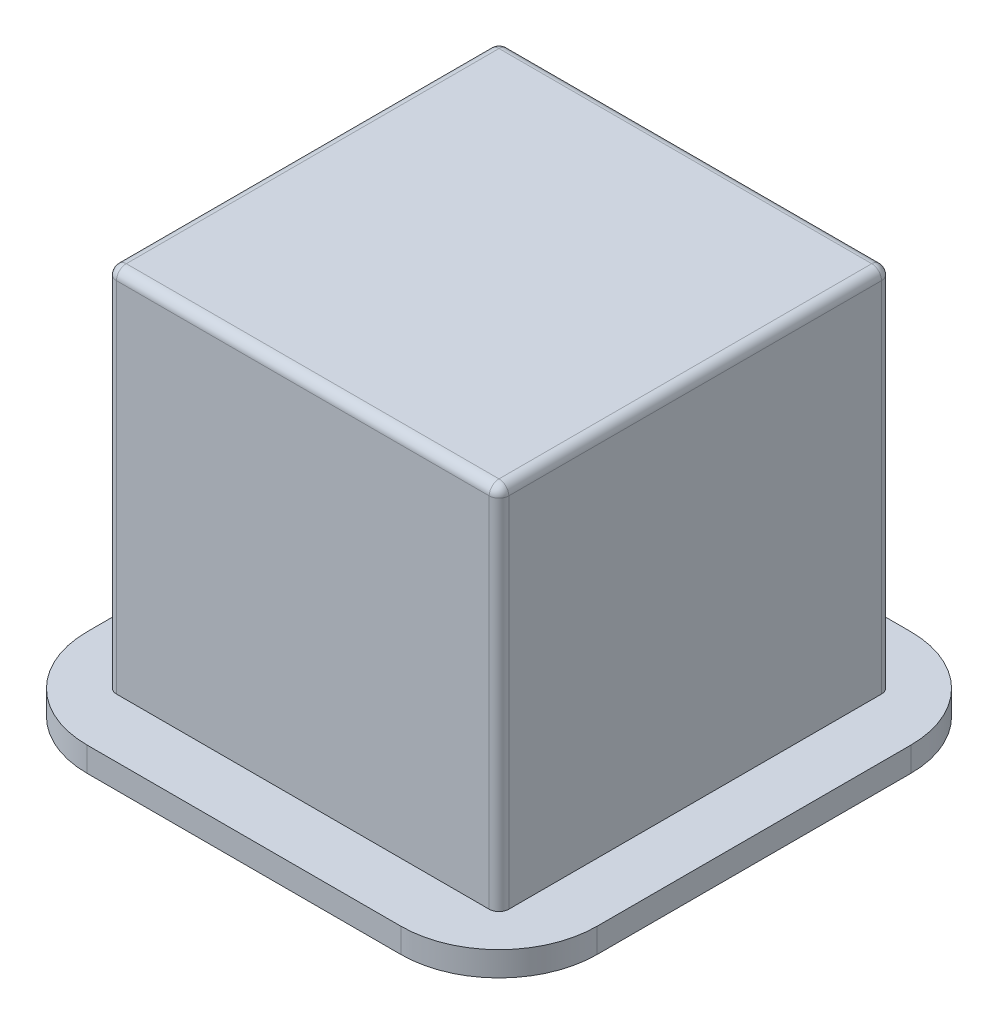
ISO-10303-21;
HEADER;
FILE_DESCRIPTION(('STEP AP214'),'2;1');
FILE_NAME('part.step','',(''),(''),'','','');
FILE_SCHEMA(('AUTOMOTIVE_DESIGN { 1 0 10303 214 1 1 1 1 }'));
ENDSEC;
DATA;
#1=APPLICATION_CONTEXT('core data for automotive mechanical design processes');
#2=APPLICATION_PROTOCOL_DEFINITION('international standard','automotive_design',2000,#1);
#3=PRODUCT_CONTEXT('',#1,'mechanical');
#4=PRODUCT('Part','Part','',(#3));
#5=PRODUCT_RELATED_PRODUCT_CATEGORY('part','',(#4));
#6=PRODUCT_DEFINITION_FORMATION('','',#4);
#7=PRODUCT_DEFINITION_CONTEXT('part definition',#1,'design');
#8=PRODUCT_DEFINITION('design','',#6,#7);
#9=PRODUCT_DEFINITION_SHAPE('','',#8);
#10=(LENGTH_UNIT() NAMED_UNIT(*) SI_UNIT(.MILLI.,.METRE.));
#11=(NAMED_UNIT(*) PLANE_ANGLE_UNIT() SI_UNIT($,.RADIAN.));
#12=(NAMED_UNIT(*) SI_UNIT($,.STERADIAN.) SOLID_ANGLE_UNIT());
#13=UNCERTAINTY_MEASURE_WITH_UNIT(LENGTH_MEASURE(1.E-05),#10,'distance_accuracy_value','');
#14=(GEOMETRIC_REPRESENTATION_CONTEXT(3) GLOBAL_UNCERTAINTY_ASSIGNED_CONTEXT((#13)) GLOBAL_UNIT_ASSIGNED_CONTEXT((#10,
#11,#12)) REPRESENTATION_CONTEXT('',''));
#15=CARTESIAN_POINT('',(0.,0.,0.));
#16=DIRECTION('',(0.,0.,1.));
#17=DIRECTION('',(1.,0.,0.));
#18=AXIS2_PLACEMENT_3D('',#15,#16,#17);
#19=CARTESIAN_POINT('',(0.,200.,0.));
#20=DIRECTION('',(1.,0.,0.));
#21=DIRECTION('',(0.,0.,-1.));
#22=AXIS2_PLACEMENT_3D('',#19,#20,#21);
#23=PLANE('',#22);
#24=DIRECTION('',(0.,0.,1.));
#25=VECTOR('',#24,1.);
#26=CARTESIAN_POINT('',(0.,195.,0.));
#27=LINE('',#26,#25);
#28=CARTESIAN_POINT('',(0.,195.,-5.));
#29=VERTEX_POINT('',#28);
#30=CARTESIAN_POINT('',(0.,195.,-195.));
#31=VERTEX_POINT('',#30);
#32=EDGE_CURVE('E50',#29,#31,#27,.F.);
#33=ORIENTED_EDGE('',*,*,#32,.T.);
#34=DIRECTION('',(0.,-1.,0.));
#35=VECTOR('',#34,1.);
#36=CARTESIAN_POINT('',(0.,200.,-195.));
#37=LINE('',#36,#35);
#38=CARTESIAN_POINT('',(0.,12.5,-195.));
#39=VERTEX_POINT('',#38);
#40=EDGE_CURVE('E260',#31,#39,#37,.T.);
#41=ORIENTED_EDGE('',*,*,#40,.T.);
#42=DIRECTION('',(0.,0.,-1.));
#43=VECTOR('',#42,1.);
#44=CARTESIAN_POINT('',(0.,12.5,-230.));
#45=LINE('',#44,#43);
#46=CARTESIAN_POINT('',(0.,12.5,-5.));
#47=VERTEX_POINT('',#46);
#48=EDGE_CURVE('E202',#47,#39,#45,.T.);
#49=ORIENTED_EDGE('',*,*,#48,.F.);
#50=DIRECTION('',(0.,-1.,0.));
#51=VECTOR('',#50,1.);
#52=CARTESIAN_POINT('',(0.,200.,-5.));
#53=LINE('',#52,#51);
#54=EDGE_CURVE('E55',#47,#29,#53,.F.);
#55=ORIENTED_EDGE('',*,*,#54,.T.);
#56=EDGE_LOOP('',(#33,#41,#49,#55));
#57=FACE_BOUND('',#56,.T.);
#58=ADVANCED_FACE('F33',(#57),#23,.F.);
#59=CARTESIAN_POINT('',(0.,200.,-200.));
#60=DIRECTION('',(0.,0.,1.));
#61=DIRECTION('',(1.,0.,0.));
#62=AXIS2_PLACEMENT_3D('',#59,#60,#61);
#63=PLANE('',#62);
#64=DIRECTION('',(-1.,0.,0.));
#65=VECTOR('',#64,1.);
#66=CARTESIAN_POINT('',(0.,195.,-200.));
#67=LINE('',#66,#65);
#68=CARTESIAN_POINT('',(5.,195.,-200.));
#69=VERTEX_POINT('',#68);
#70=CARTESIAN_POINT('',(195.,195.,-200.));
#71=VERTEX_POINT('',#70);
#72=EDGE_CURVE('E232',#69,#71,#67,.F.);
#73=ORIENTED_EDGE('',*,*,#72,.T.);
#74=DIRECTION('',(0.,-1.,0.));
#75=VECTOR('',#74,1.);
#76=CARTESIAN_POINT('',(195.,200.,-200.));
#77=LINE('',#76,#75);
#78=CARTESIAN_POINT('',(195.,12.5,-200.));
#79=VERTEX_POINT('',#78);
#80=EDGE_CURVE('E234',#71,#79,#77,.T.);
#81=ORIENTED_EDGE('',*,*,#80,.T.);
#82=DIRECTION('',(1.,0.,0.));
#83=VECTOR('',#82,1.);
#84=CARTESIAN_POINT('',(230.,12.5,-200.));
#85=LINE('',#84,#83);
#86=CARTESIAN_POINT('',(5.,12.5,-200.));
#87=VERTEX_POINT('',#86);
#88=EDGE_CURVE('E194',#87,#79,#85,.T.);
#89=ORIENTED_EDGE('',*,*,#88,.F.);
#90=DIRECTION('',(0.,-1.,0.));
#91=VECTOR('',#90,1.);
#92=CARTESIAN_POINT('',(5.,200.,-200.));
#93=LINE('',#92,#91);
#94=EDGE_CURVE('E230',#87,#69,#93,.F.);
#95=ORIENTED_EDGE('',*,*,#94,.T.);
#96=EDGE_LOOP('',(#73,#81,#89,#95));
#97=FACE_BOUND('',#96,.T.);
#98=ADVANCED_FACE('F351',(#97),#63,.F.);
#99=CARTESIAN_POINT('',(200.,200.,0.));
#100=DIRECTION('',(-1.,0.,0.));
#101=DIRECTION('',(0.,0.,1.));
#102=AXIS2_PLACEMENT_3D('',#99,#100,#101);
#103=PLANE('',#102);
#104=DIRECTION('',(0.,0.,1.));
#105=VECTOR('',#104,1.);
#106=CARTESIAN_POINT('',(200.,12.5,30.));
#107=LINE('',#106,#105);
#108=CARTESIAN_POINT('',(200.,12.5,-195.));
#109=VERTEX_POINT('',#108);
#110=CARTESIAN_POINT('',(200.,12.5,-5.));
#111=VERTEX_POINT('',#110);
#112=EDGE_CURVE('E186',#109,#111,#107,.T.);
#113=ORIENTED_EDGE('',*,*,#112,.F.);
#114=DIRECTION('',(0.,-1.,0.));
#115=VECTOR('',#114,1.);
#116=CARTESIAN_POINT('',(200.,200.,-195.));
#117=LINE('',#116,#115);
#118=CARTESIAN_POINT('',(200.,195.,-195.));
#119=VERTEX_POINT('',#118);
#120=EDGE_CURVE('E241',#109,#119,#117,.F.);
#121=ORIENTED_EDGE('',*,*,#120,.T.);
#122=DIRECTION('',(0.,0.,-1.));
#123=VECTOR('',#122,1.);
#124=CARTESIAN_POINT('',(200.,195.,0.));
#125=LINE('',#124,#123);
#126=CARTESIAN_POINT('',(200.,195.,-5.));
#127=VERTEX_POINT('',#126);
#128=EDGE_CURVE('E237',#119,#127,#125,.F.);
#129=ORIENTED_EDGE('',*,*,#128,.T.);
#130=DIRECTION('',(0.,-1.,0.));
#131=VECTOR('',#130,1.);
#132=CARTESIAN_POINT('',(200.,200.,-5.));
#133=LINE('',#132,#131);
#134=EDGE_CURVE('E239',#127,#111,#133,.T.);
#135=ORIENTED_EDGE('',*,*,#134,.T.);
#136=EDGE_LOOP('',(#113,#121,#129,#135));
#137=FACE_BOUND('',#136,.T.);
#138=ADVANCED_FACE('F356',(#137),#103,.F.);
#139=CARTESIAN_POINT('',(0.,200.,0.));
#140=DIRECTION('',(0.,0.,-1.));
#141=DIRECTION('',(-1.,0.,0.));
#142=AXIS2_PLACEMENT_3D('',#139,#140,#141);
#143=PLANE('',#142);
#144=DIRECTION('',(-1.,0.,0.));
#145=VECTOR('',#144,1.);
#146=CARTESIAN_POINT('',(0.,12.5,0.));
#147=LINE('',#146,#145);
#148=CARTESIAN_POINT('',(195.,12.5,0.));
#149=VERTEX_POINT('',#148);
#150=CARTESIAN_POINT('',(5.,12.5,0.));
#151=VERTEX_POINT('',#150);
#152=EDGE_CURVE('E188',#149,#151,#147,.T.);
#153=ORIENTED_EDGE('',*,*,#152,.F.);
#154=DIRECTION('',(0.,-1.,0.));
#155=VECTOR('',#154,1.);
#156=CARTESIAN_POINT('',(195.,200.,0.));
#157=LINE('',#156,#155);
#158=CARTESIAN_POINT('',(195.,195.,0.));
#159=VERTEX_POINT('',#158);
#160=EDGE_CURVE('E247',#149,#159,#157,.F.);
#161=ORIENTED_EDGE('',*,*,#160,.T.);
#162=DIRECTION('',(1.,0.,0.));
#163=VECTOR('',#162,1.);
#164=CARTESIAN_POINT('',(0.,195.,0.));
#165=LINE('',#164,#163);
#166=CARTESIAN_POINT('',(5.,195.,0.));
#167=VERTEX_POINT('',#166);
#168=EDGE_CURVE('E245',#159,#167,#165,.F.);
#169=ORIENTED_EDGE('',*,*,#168,.T.);
#170=DIRECTION('',(0.,-1.,0.));
#171=VECTOR('',#170,1.);
#172=CARTESIAN_POINT('',(5.,200.,0.));
#173=LINE('',#172,#171);
#174=EDGE_CURVE('E243',#167,#151,#173,.T.);
#175=ORIENTED_EDGE('',*,*,#174,.T.);
#176=EDGE_LOOP('',(#153,#161,#169,#175));
#177=FACE_BOUND('',#176,.T.);
#178=ADVANCED_FACE('F360',(#177),#143,.F.);
#179=CARTESIAN_POINT('',(0.,200.,0.));
#180=DIRECTION('',(0.,-1.,0.));
#181=DIRECTION('',(0.,0.,-1.));
#182=AXIS2_PLACEMENT_3D('',#179,#180,#181);
#183=PLANE('',#182);
#184=DIRECTION('',(0.,0.,-1.));
#185=VECTOR('',#184,1.);
#186=CARTESIAN_POINT('',(195.,200.,0.));
#187=LINE('',#186,#185);
#188=CARTESIAN_POINT('',(195.,200.,-5.));
#189=VERTEX_POINT('',#188);
#190=CARTESIAN_POINT('',(195.,200.,-195.));
#191=VERTEX_POINT('',#190);
#192=EDGE_CURVE('E253',#189,#191,#187,.T.);
#193=ORIENTED_EDGE('',*,*,#192,.T.);
#194=DIRECTION('',(-1.,0.,0.));
#195=VECTOR('',#194,1.);
#196=CARTESIAN_POINT('',(0.,200.,-195.));
#197=LINE('',#196,#195);
#198=CARTESIAN_POINT('',(5.,200.,-195.));
#199=VERTEX_POINT('',#198);
#200=EDGE_CURVE('E255',#191,#199,#197,.T.);
#201=ORIENTED_EDGE('',*,*,#200,.T.);
#202=DIRECTION('',(0.,0.,1.));
#203=VECTOR('',#202,1.);
#204=CARTESIAN_POINT('',(5.,200.,0.));
#205=LINE('',#204,#203);
#206=CARTESIAN_POINT('',(5.,200.,-5.));
#207=VERTEX_POINT('',#206);
#208=EDGE_CURVE('E251',#199,#207,#205,.T.);
#209=ORIENTED_EDGE('',*,*,#208,.T.);
#210=DIRECTION('',(1.,0.,0.));
#211=VECTOR('',#210,1.);
#212=CARTESIAN_POINT('',(0.,200.,-5.));
#213=LINE('',#212,#211);
#214=EDGE_CURVE('E249',#207,#189,#213,.T.);
#215=ORIENTED_EDGE('',*,*,#214,.T.);
#216=EDGE_LOOP('',(#193,#201,#209,#215));
#217=FACE_BOUND('',#216,.T.);
#218=ADVANCED_FACE('F438',(#217),#183,.F.);
#219=CARTESIAN_POINT('',(0.,0.,0.));
#220=DIRECTION('',(0.,-1.,0.));
#221=DIRECTION('',(0.,0.,-1.));
#222=AXIS2_PLACEMENT_3D('',#219,#220,#221);
#223=PLANE('',#222);
#224=DIRECTION('',(0.,0.,-1.));
#225=VECTOR('',#224,1.);
#226=CARTESIAN_POINT('',(230.,0.,30.));
#227=LINE('',#226,#225);
#228=CARTESIAN_POINT('',(230.,0.,-20.));
#229=VERTEX_POINT('',#228);
#230=CARTESIAN_POINT('',(230.,0.,-180.));
#231=VERTEX_POINT('',#230);
#232=EDGE_CURVE('E176',#229,#231,#227,.T.);
#233=ORIENTED_EDGE('',*,*,#232,.F.);
#234=CARTESIAN_POINT('',(180.,0.,-20.));
#235=DIRECTION('',(0.,-1.,0.));
#236=DIRECTION('',(0.,0.,-1.));
#237=AXIS2_PLACEMENT_3D('',#234,#235,#236);
#238=CIRCLE('',#237,50.);
#239=CARTESIAN_POINT('',(180.,0.,30.));
#240=VERTEX_POINT('',#239);
#241=EDGE_CURVE('E159',#229,#240,#238,.T.);
#242=ORIENTED_EDGE('',*,*,#241,.T.);
#243=DIRECTION('',(1.,0.,0.));
#244=VECTOR('',#243,1.);
#245=CARTESIAN_POINT('',(0.,0.,30.));
#246=LINE('',#245,#244);
#247=CARTESIAN_POINT('',(20.,0.,30.));
#248=VERTEX_POINT('',#247);
#249=EDGE_CURVE('E197',#248,#240,#246,.T.);
#250=ORIENTED_EDGE('',*,*,#249,.F.);
#251=CARTESIAN_POINT('',(20.,0.,-20.));
#252=DIRECTION('',(0.,-1.,0.));
#253=DIRECTION('',(0.,0.,-1.));
#254=AXIS2_PLACEMENT_3D('',#251,#252,#253);
#255=CIRCLE('',#254,50.);
#256=CARTESIAN_POINT('',(-30.,0.,-20.));
#257=VERTEX_POINT('',#256);
#258=EDGE_CURVE('E170',#248,#257,#255,.T.);
#259=ORIENTED_EDGE('',*,*,#258,.T.);
#260=DIRECTION('',(0.,0.,1.));
#261=VECTOR('',#260,1.);
#262=CARTESIAN_POINT('',(-30.,0.,-230.));
#263=LINE('',#262,#261);
#264=CARTESIAN_POINT('',(-30.,0.,-180.));
#265=VERTEX_POINT('',#264);
#266=EDGE_CURVE('E302',#265,#257,#263,.T.);
#267=ORIENTED_EDGE('',*,*,#266,.F.);
#268=CARTESIAN_POINT('',(20.,0.,-180.));
#269=DIRECTION('',(0.,-1.,0.));
#270=DIRECTION('',(0.,0.,-1.));
#271=AXIS2_PLACEMENT_3D('',#268,#269,#270);
#272=CIRCLE('',#271,50.);
#273=CARTESIAN_POINT('',(20.,0.,-230.));
#274=VERTEX_POINT('',#273);
#275=EDGE_CURVE('E180',#265,#274,#272,.T.);
#276=ORIENTED_EDGE('',*,*,#275,.T.);
#277=DIRECTION('',(-1.,0.,0.));
#278=VECTOR('',#277,1.);
#279=CARTESIAN_POINT('',(230.,0.,-230.));
#280=LINE('',#279,#278);
#281=CARTESIAN_POINT('',(180.,0.,-230.));
#282=VERTEX_POINT('',#281);
#283=EDGE_CURVE('E316',#282,#274,#280,.T.);
#284=ORIENTED_EDGE('',*,*,#283,.F.);
#285=CARTESIAN_POINT('',(180.,0.,-180.));
#286=DIRECTION('',(0.,-1.,0.));
#287=DIRECTION('',(0.,0.,-1.));
#288=AXIS2_PLACEMENT_3D('',#285,#286,#287);
#289=CIRCLE('',#288,50.);
#290=EDGE_CURVE('E185',#282,#231,#289,.T.);
#291=ORIENTED_EDGE('',*,*,#290,.T.);
#292=EDGE_LOOP('',(#233,#242,#250,#259,#267,#276,#284,#291));
#293=FACE_BOUND('',#292,.T.);
#294=ADVANCED_FACE('F183',(#293),#223,.T.);
#295=CARTESIAN_POINT('',(0.,12.5,30.));
#296=DIRECTION('',(0.,-1.,0.));
#297=DIRECTION('',(0.,0.,-1.));
#298=AXIS2_PLACEMENT_3D('',#295,#296,#297);
#299=PLANE('',#298);
#300=ORIENTED_EDGE('',*,*,#112,.T.);
#301=CARTESIAN_POINT('',(195.,12.5,-5.));
#302=DIRECTION('',(0.,-1.,0.));
#303=DIRECTION('',(0.,0.,-1.));
#304=AXIS2_PLACEMENT_3D('',#301,#302,#303);
#305=CIRCLE('',#304,5.);
#306=EDGE_CURVE('E264',#111,#149,#305,.T.);
#307=ORIENTED_EDGE('',*,*,#306,.T.);
#308=ORIENTED_EDGE('',*,*,#152,.T.);
#309=CARTESIAN_POINT('',(5.,12.5,-5.));
#310=DIRECTION('',(0.,-1.,0.));
#311=DIRECTION('',(0.,0.,-1.));
#312=AXIS2_PLACEMENT_3D('',#309,#310,#311);
#313=CIRCLE('',#312,5.);
#314=EDGE_CURVE('E11',#151,#47,#313,.T.);
#315=ORIENTED_EDGE('',*,*,#314,.T.);
#316=ORIENTED_EDGE('',*,*,#48,.T.);
#317=CARTESIAN_POINT('',(5.,12.5,-195.));
#318=DIRECTION('',(0.,-1.,0.));
#319=DIRECTION('',(0.,0.,-1.));
#320=AXIS2_PLACEMENT_3D('',#317,#318,#319);
#321=CIRCLE('',#320,5.);
#322=EDGE_CURVE('E42',#39,#87,#321,.T.);
#323=ORIENTED_EDGE('',*,*,#322,.T.);
#324=ORIENTED_EDGE('',*,*,#88,.T.);
#325=CARTESIAN_POINT('',(195.,12.5,-195.));
#326=DIRECTION('',(0.,-1.,0.));
#327=DIRECTION('',(0.,0.,-1.));
#328=AXIS2_PLACEMENT_3D('',#325,#326,#327);
#329=CIRCLE('',#328,5.);
#330=EDGE_CURVE('E262',#79,#109,#329,.T.);
#331=ORIENTED_EDGE('',*,*,#330,.T.);
#332=EDGE_LOOP('',(#300,#307,#308,#315,#316,#323,#324,#331));
#333=FACE_BOUND('',#332,.T.);
#334=DIRECTION('',(-1.,0.,0.));
#335=VECTOR('',#334,1.);
#336=CARTESIAN_POINT('',(0.,12.5,30.));
#337=LINE('',#336,#335);
#338=CARTESIAN_POINT('',(180.,12.5,30.));
#339=VERTEX_POINT('',#338);
#340=CARTESIAN_POINT('',(20.,12.5,30.));
#341=VERTEX_POINT('',#340);
#342=EDGE_CURVE('E199',#339,#341,#337,.T.);
#343=ORIENTED_EDGE('',*,*,#342,.F.);
#344=CARTESIAN_POINT('',(180.,12.5,-20.));
#345=DIRECTION('',(0.,-1.,0.));
#346=DIRECTION('',(0.,0.,-1.));
#347=AXIS2_PLACEMENT_3D('',#344,#345,#346);
#348=CIRCLE('',#347,50.);
#349=CARTESIAN_POINT('',(230.,12.5,-20.));
#350=VERTEX_POINT('',#349);
#351=EDGE_CURVE('E217',#339,#350,#348,.F.);
#352=ORIENTED_EDGE('',*,*,#351,.T.);
#353=DIRECTION('',(0.,0.,1.));
#354=VECTOR('',#353,1.);
#355=CARTESIAN_POINT('',(230.,12.5,30.));
#356=LINE('',#355,#354);
#357=CARTESIAN_POINT('',(230.,12.5,-180.));
#358=VERTEX_POINT('',#357);
#359=EDGE_CURVE('E179',#358,#350,#356,.T.);
#360=ORIENTED_EDGE('',*,*,#359,.F.);
#361=CARTESIAN_POINT('',(180.,12.5,-180.));
#362=DIRECTION('',(0.,-1.,0.));
#363=DIRECTION('',(0.,0.,-1.));
#364=AXIS2_PLACEMENT_3D('',#361,#362,#363);
#365=CIRCLE('',#364,50.);
#366=CARTESIAN_POINT('',(180.,12.5,-230.));
#367=VERTEX_POINT('',#366);
#368=EDGE_CURVE('E213',#358,#367,#365,.F.);
#369=ORIENTED_EDGE('',*,*,#368,.T.);
#370=DIRECTION('',(1.,0.,0.));
#371=VECTOR('',#370,1.);
#372=CARTESIAN_POINT('',(230.,12.5,-230.));
#373=LINE('',#372,#371);
#374=CARTESIAN_POINT('',(20.,12.5,-230.));
#375=VERTEX_POINT('',#374);
#376=EDGE_CURVE('E191',#375,#367,#373,.T.);
#377=ORIENTED_EDGE('',*,*,#376,.F.);
#378=CARTESIAN_POINT('',(20.,12.5,-180.));
#379=DIRECTION('',(0.,-1.,0.));
#380=DIRECTION('',(0.,0.,-1.));
#381=AXIS2_PLACEMENT_3D('',#378,#379,#380);
#382=CIRCLE('',#381,50.);
#383=CARTESIAN_POINT('',(-30.,12.5,-180.));
#384=VERTEX_POINT('',#383);
#385=EDGE_CURVE('E211',#375,#384,#382,.F.);
#386=ORIENTED_EDGE('',*,*,#385,.T.);
#387=DIRECTION('',(0.,0.,-1.));
#388=VECTOR('',#387,1.);
#389=CARTESIAN_POINT('',(-30.,12.5,-230.));
#390=LINE('',#389,#388);
#391=CARTESIAN_POINT('',(-30.,12.5,-20.));
#392=VERTEX_POINT('',#391);
#393=EDGE_CURVE('E306',#392,#384,#390,.T.);
#394=ORIENTED_EDGE('',*,*,#393,.F.);
#395=CARTESIAN_POINT('',(20.,12.5,-20.));
#396=DIRECTION('',(0.,-1.,0.));
#397=DIRECTION('',(0.,0.,-1.));
#398=AXIS2_PLACEMENT_3D('',#395,#396,#397);
#399=CIRCLE('',#398,50.);
#400=EDGE_CURVE('E215',#392,#341,#399,.F.);
#401=ORIENTED_EDGE('',*,*,#400,.T.);
#402=EDGE_LOOP('',(#343,#352,#360,#369,#377,#386,#394,#401));
#403=FACE_BOUND('',#402,.T.);
#404=ADVANCED_FACE('F330',(#333,#403),#299,.F.);
#405=CARTESIAN_POINT('',(0.,0.,30.));
#406=DIRECTION('',(0.,0.,-1.));
#407=DIRECTION('',(-1.,0.,0.));
#408=AXIS2_PLACEMENT_3D('',#405,#406,#407);
#409=PLANE('',#408);
#410=ORIENTED_EDGE('',*,*,#249,.T.);
#411=DIRECTION('',(0.,-1.,0.));
#412=VECTOR('',#411,1.);
#413=CARTESIAN_POINT('',(180.,12.5,30.));
#414=LINE('',#413,#412);
#415=EDGE_CURVE('E164',#240,#339,#414,.F.);
#416=ORIENTED_EDGE('',*,*,#415,.T.);
#417=ORIENTED_EDGE('',*,*,#342,.T.);
#418=DIRECTION('',(0.,1.,0.));
#419=VECTOR('',#418,1.);
#420=CARTESIAN_POINT('',(20.,0.,30.));
#421=LINE('',#420,#419);
#422=EDGE_CURVE('E169',#341,#248,#421,.F.);
#423=ORIENTED_EDGE('',*,*,#422,.T.);
#424=EDGE_LOOP('',(#410,#416,#417,#423));
#425=FACE_BOUND('',#424,.T.);
#426=ADVANCED_FACE('F334',(#425),#409,.F.);
#427=CARTESIAN_POINT('',(230.,0.,0.));
#428=DIRECTION('',(1.,0.,0.));
#429=DIRECTION('',(0.,0.,-1.));
#430=AXIS2_PLACEMENT_3D('',#427,#428,#429);
#431=PLANE('',#430);
#432=ORIENTED_EDGE('',*,*,#359,.T.);
#433=DIRECTION('',(0.,-1.,0.));
#434=VECTOR('',#433,1.);
#435=CARTESIAN_POINT('',(230.,0.,-20.));
#436=LINE('',#435,#434);
#437=EDGE_CURVE('E163',#350,#229,#436,.T.);
#438=ORIENTED_EDGE('',*,*,#437,.T.);
#439=ORIENTED_EDGE('',*,*,#232,.T.);
#440=DIRECTION('',(0.,-1.,0.));
#441=VECTOR('',#440,1.);
#442=CARTESIAN_POINT('',(230.,0.,-180.));
#443=LINE('',#442,#441);
#444=EDGE_CURVE('E181',#231,#358,#443,.F.);
#445=ORIENTED_EDGE('',*,*,#444,.T.);
#446=EDGE_LOOP('',(#432,#438,#439,#445));
#447=FACE_BOUND('',#446,.T.);
#448=ADVANCED_FACE('F175',(#447),#431,.T.);
#449=CARTESIAN_POINT('',(0.,0.,-230.));
#450=DIRECTION('',(0.,0.,-1.));
#451=DIRECTION('',(-1.,0.,0.));
#452=AXIS2_PLACEMENT_3D('',#449,#450,#451);
#453=PLANE('',#452);
#454=ORIENTED_EDGE('',*,*,#376,.T.);
#455=DIRECTION('',(0.,-1.,0.));
#456=VECTOR('',#455,1.);
#457=CARTESIAN_POINT('',(180.,0.,-230.));
#458=LINE('',#457,#456);
#459=EDGE_CURVE('E227',#367,#282,#458,.T.);
#460=ORIENTED_EDGE('',*,*,#459,.T.);
#461=ORIENTED_EDGE('',*,*,#283,.T.);
#462=DIRECTION('',(0.,-1.,0.));
#463=VECTOR('',#462,1.);
#464=CARTESIAN_POINT('',(20.,0.,-230.));
#465=LINE('',#464,#463);
#466=EDGE_CURVE('E225',#274,#375,#465,.F.);
#467=ORIENTED_EDGE('',*,*,#466,.T.);
#468=EDGE_LOOP('',(#454,#460,#461,#467));
#469=FACE_BOUND('',#468,.T.);
#470=ADVANCED_FACE('F322',(#469),#453,.T.);
#471=CARTESIAN_POINT('',(-30.,0.,0.));
#472=DIRECTION('',(-1.,0.,0.));
#473=DIRECTION('',(0.,0.,1.));
#474=AXIS2_PLACEMENT_3D('',#471,#472,#473);
#475=PLANE('',#474);
#476=ORIENTED_EDGE('',*,*,#266,.T.);
#477=DIRECTION('',(0.,1.,0.));
#478=VECTOR('',#477,1.);
#479=CARTESIAN_POINT('',(-30.,12.5,-20.));
#480=LINE('',#479,#478);
#481=EDGE_CURVE('E222',#257,#392,#480,.T.);
#482=ORIENTED_EDGE('',*,*,#481,.T.);
#483=ORIENTED_EDGE('',*,*,#393,.T.);
#484=DIRECTION('',(0.,-1.,0.));
#485=VECTOR('',#484,1.);
#486=CARTESIAN_POINT('',(-30.,0.,-180.));
#487=LINE('',#486,#485);
#488=EDGE_CURVE('E219',#384,#265,#487,.T.);
#489=ORIENTED_EDGE('',*,*,#488,.T.);
#490=EDGE_LOOP('',(#476,#482,#483,#489));
#491=FACE_BOUND('',#490,.T.);
#492=ADVANCED_FACE('F341',(#491),#475,.T.);
#493=CARTESIAN_POINT('',(180.,0.,-20.));
#494=DIRECTION('',(0.,1.,0.));
#495=DIRECTION('',(0.,0.,1.));
#496=AXIS2_PLACEMENT_3D('',#493,#494,#495);
#497=CYLINDRICAL_SURFACE('',#496,50.);
#498=ORIENTED_EDGE('',*,*,#351,.F.);
#499=ORIENTED_EDGE('',*,*,#415,.F.);
#500=ORIENTED_EDGE('',*,*,#241,.F.);
#501=ORIENTED_EDGE('',*,*,#437,.F.);
#502=EDGE_LOOP('',(#498,#499,#500,#501));
#503=FACE_BOUND('',#502,.T.);
#504=ADVANCED_FACE('F162',(#503),#497,.T.);
#505=CARTESIAN_POINT('',(20.,0.,-20.));
#506=DIRECTION('',(0.,-1.,0.));
#507=DIRECTION('',(0.,0.,-1.));
#508=AXIS2_PLACEMENT_3D('',#505,#506,#507);
#509=CYLINDRICAL_SURFACE('',#508,50.);
#510=ORIENTED_EDGE('',*,*,#258,.F.);
#511=ORIENTED_EDGE('',*,*,#422,.F.);
#512=ORIENTED_EDGE('',*,*,#400,.F.);
#513=ORIENTED_EDGE('',*,*,#481,.F.);
#514=EDGE_LOOP('',(#510,#511,#512,#513));
#515=FACE_BOUND('',#514,.T.);
#516=ADVANCED_FACE('F337',(#515),#509,.T.);
#517=CARTESIAN_POINT('',(180.,0.,-180.));
#518=DIRECTION('',(0.,-1.,0.));
#519=DIRECTION('',(0.,0.,-1.));
#520=AXIS2_PLACEMENT_3D('',#517,#518,#519);
#521=CYLINDRICAL_SURFACE('',#520,50.);
#522=ORIENTED_EDGE('',*,*,#368,.F.);
#523=ORIENTED_EDGE('',*,*,#444,.F.);
#524=ORIENTED_EDGE('',*,*,#290,.F.);
#525=ORIENTED_EDGE('',*,*,#459,.F.);
#526=EDGE_LOOP('',(#522,#523,#524,#525));
#527=FACE_BOUND('',#526,.T.);
#528=ADVANCED_FACE('F328',(#527),#521,.T.);
#529=CARTESIAN_POINT('',(20.,0.,-180.));
#530=DIRECTION('',(0.,-1.,0.));
#531=DIRECTION('',(0.,0.,-1.));
#532=AXIS2_PLACEMENT_3D('',#529,#530,#531);
#533=CYLINDRICAL_SURFACE('',#532,50.);
#534=ORIENTED_EDGE('',*,*,#385,.F.);
#535=ORIENTED_EDGE('',*,*,#466,.F.);
#536=ORIENTED_EDGE('',*,*,#275,.F.);
#537=ORIENTED_EDGE('',*,*,#488,.F.);
#538=EDGE_LOOP('',(#534,#535,#536,#537));
#539=FACE_BOUND('',#538,.T.);
#540=ADVANCED_FACE('F340',(#539),#533,.T.);
#541=CARTESIAN_POINT('',(5.,200.,-5.));
#542=DIRECTION('',(0.,-1.,0.));
#543=DIRECTION('',(0.,0.,-1.));
#544=AXIS2_PLACEMENT_3D('',#541,#542,#543);
#545=CYLINDRICAL_SURFACE('',#544,5.);
#546=CARTESIAN_POINT('',(5.,195.,-5.));
#547=DIRECTION('',(0.,1.,0.));
#548=DIRECTION('',(0.,0.,1.));
#549=AXIS2_PLACEMENT_3D('',#546,#547,#548);
#550=CIRCLE('',#549,5.);
#551=EDGE_CURVE('E37',#29,#167,#550,.T.);
#552=ORIENTED_EDGE('',*,*,#551,.F.);
#553=ORIENTED_EDGE('',*,*,#54,.F.);
#554=ORIENTED_EDGE('',*,*,#314,.F.);
#555=ORIENTED_EDGE('',*,*,#174,.F.);
#556=EDGE_LOOP('',(#552,#553,#554,#555));
#557=FACE_BOUND('',#556,.T.);
#558=ADVANCED_FACE('F35',(#557),#545,.T.);
#559=CARTESIAN_POINT('',(5.,195.,-5.));
#560=DIRECTION('',(0.,0.,1.));
#561=DIRECTION('',(1.,0.,0.));
#562=AXIS2_PLACEMENT_3D('',#559,#560,#561);
#563=SPHERICAL_SURFACE('',#562,5.);
#564=CARTESIAN_POINT('',(5.,195.,-5.));
#565=DIRECTION('',(0.,0.,1.));
#566=DIRECTION('',(1.,0.,0.));
#567=AXIS2_PLACEMENT_3D('',#564,#565,#566);
#568=CIRCLE('',#567,5.);
#569=EDGE_CURVE('E293',#29,#207,#568,.F.);
#570=ORIENTED_EDGE('',*,*,#569,.F.);
#571=ORIENTED_EDGE('',*,*,#551,.T.);
#572=CARTESIAN_POINT('',(5.,195.,-5.));
#573=DIRECTION('',(-1.,0.,0.));
#574=DIRECTION('',(0.,0.,1.));
#575=AXIS2_PLACEMENT_3D('',#572,#573,#574);
#576=CIRCLE('',#575,5.);
#577=EDGE_CURVE('E295',#207,#167,#576,.F.);
#578=ORIENTED_EDGE('',*,*,#577,.F.);
#579=EDGE_LOOP('',(#570,#571,#578));
#580=FACE_BOUND('',#579,.T.);
#581=ADVANCED_FACE('F406',(#580),#563,.T.);
#582=CARTESIAN_POINT('',(195.,200.,-5.));
#583=DIRECTION('',(0.,-1.,0.));
#584=DIRECTION('',(0.,0.,-1.));
#585=AXIS2_PLACEMENT_3D('',#582,#583,#584);
#586=CYLINDRICAL_SURFACE('',#585,5.);
#587=ORIENTED_EDGE('',*,*,#306,.F.);
#588=ORIENTED_EDGE('',*,*,#134,.F.);
#589=CARTESIAN_POINT('',(195.,195.,-5.));
#590=DIRECTION('',(0.,1.,0.));
#591=DIRECTION('',(0.,0.,1.));
#592=AXIS2_PLACEMENT_3D('',#589,#590,#591);
#593=CIRCLE('',#592,5.);
#594=EDGE_CURVE('E290',#159,#127,#593,.T.);
#595=ORIENTED_EDGE('',*,*,#594,.F.);
#596=ORIENTED_EDGE('',*,*,#160,.F.);
#597=EDGE_LOOP('',(#587,#588,#595,#596));
#598=FACE_BOUND('',#597,.T.);
#599=ADVANCED_FACE('F404',(#598),#586,.T.);
#600=CARTESIAN_POINT('',(0.,195.,-5.));
#601=DIRECTION('',(1.,0.,0.));
#602=DIRECTION('',(0.,0.,-1.));
#603=AXIS2_PLACEMENT_3D('',#600,#601,#602);
#604=CYLINDRICAL_SURFACE('',#603,5.);
#605=ORIENTED_EDGE('',*,*,#577,.T.);
#606=ORIENTED_EDGE('',*,*,#168,.F.);
#607=CARTESIAN_POINT('',(195.,195.,-5.));
#608=DIRECTION('',(1.,0.,0.));
#609=DIRECTION('',(0.,0.,-1.));
#610=AXIS2_PLACEMENT_3D('',#607,#608,#609);
#611=CIRCLE('',#610,5.);
#612=EDGE_CURVE('E287',#189,#159,#611,.T.);
#613=ORIENTED_EDGE('',*,*,#612,.F.);
#614=ORIENTED_EDGE('',*,*,#214,.F.);
#615=EDGE_LOOP('',(#605,#606,#613,#614));
#616=FACE_BOUND('',#615,.T.);
#617=ADVANCED_FACE('F400',(#616),#604,.T.);
#618=CARTESIAN_POINT('',(5.,195.,0.));
#619=DIRECTION('',(0.,0.,1.));
#620=DIRECTION('',(1.,0.,0.));
#621=AXIS2_PLACEMENT_3D('',#618,#619,#620);
#622=CYLINDRICAL_SURFACE('',#621,5.);
#623=ORIENTED_EDGE('',*,*,#569,.T.);
#624=ORIENTED_EDGE('',*,*,#208,.F.);
#625=CARTESIAN_POINT('',(5.,195.,-195.));
#626=DIRECTION('',(0.,0.,-1.));
#627=DIRECTION('',(-1.,0.,0.));
#628=AXIS2_PLACEMENT_3D('',#625,#626,#627);
#629=CIRCLE('',#628,5.);
#630=EDGE_CURVE('E284',#31,#199,#629,.T.);
#631=ORIENTED_EDGE('',*,*,#630,.F.);
#632=ORIENTED_EDGE('',*,*,#32,.F.);
#633=EDGE_LOOP('',(#623,#624,#631,#632));
#634=FACE_BOUND('',#633,.T.);
#635=ADVANCED_FACE('F396',(#634),#622,.T.);
#636=CARTESIAN_POINT('',(5.,200.,-195.));
#637=DIRECTION('',(0.,-1.,0.));
#638=DIRECTION('',(0.,0.,-1.));
#639=AXIS2_PLACEMENT_3D('',#636,#637,#638);
#640=CYLINDRICAL_SURFACE('',#639,5.);
#641=ORIENTED_EDGE('',*,*,#322,.F.);
#642=ORIENTED_EDGE('',*,*,#40,.F.);
#643=CARTESIAN_POINT('',(5.,195.,-195.));
#644=DIRECTION('',(0.,1.,0.));
#645=DIRECTION('',(0.,0.,1.));
#646=AXIS2_PLACEMENT_3D('',#643,#644,#645);
#647=CIRCLE('',#646,5.);
#648=EDGE_CURVE('E281',#69,#31,#647,.T.);
#649=ORIENTED_EDGE('',*,*,#648,.F.);
#650=ORIENTED_EDGE('',*,*,#94,.F.);
#651=EDGE_LOOP('',(#641,#642,#649,#650));
#652=FACE_BOUND('',#651,.T.);
#653=ADVANCED_FACE('F392',(#652),#640,.T.);
#654=CARTESIAN_POINT('',(195.,195.,-5.));
#655=DIRECTION('',(0.,0.,1.));
#656=DIRECTION('',(1.,0.,0.));
#657=AXIS2_PLACEMENT_3D('',#654,#655,#656);
#658=SPHERICAL_SURFACE('',#657,5.);
#659=ORIENTED_EDGE('',*,*,#612,.T.);
#660=ORIENTED_EDGE('',*,*,#594,.T.);
#661=CARTESIAN_POINT('',(195.,195.,-5.));
#662=DIRECTION('',(0.,0.,1.));
#663=DIRECTION('',(1.,0.,0.));
#664=AXIS2_PLACEMENT_3D('',#661,#662,#663);
#665=CIRCLE('',#664,5.);
#666=EDGE_CURVE('E278',#189,#127,#665,.F.);
#667=ORIENTED_EDGE('',*,*,#666,.F.);
#668=EDGE_LOOP('',(#659,#660,#667));
#669=FACE_BOUND('',#668,.T.);
#670=ADVANCED_FACE('F388',(#669),#658,.T.);
#671=CARTESIAN_POINT('',(5.,195.,-195.));
#672=DIRECTION('',(0.,0.,1.));
#673=DIRECTION('',(1.,0.,0.));
#674=AXIS2_PLACEMENT_3D('',#671,#672,#673);
#675=SPHERICAL_SURFACE('',#674,5.);
#676=ORIENTED_EDGE('',*,*,#648,.T.);
#677=ORIENTED_EDGE('',*,*,#630,.T.);
#678=CARTESIAN_POINT('',(5.,195.,-195.));
#679=DIRECTION('',(-1.,0.,0.));
#680=DIRECTION('',(0.,0.,1.));
#681=AXIS2_PLACEMENT_3D('',#678,#679,#680);
#682=CIRCLE('',#681,5.);
#683=EDGE_CURVE('E276',#69,#199,#682,.F.);
#684=ORIENTED_EDGE('',*,*,#683,.F.);
#685=EDGE_LOOP('',(#676,#677,#684));
#686=FACE_BOUND('',#685,.T.);
#687=ADVANCED_FACE('F384',(#686),#675,.T.);
#688=CARTESIAN_POINT('',(195.,195.,0.));
#689=DIRECTION('',(0.,0.,-1.));
#690=DIRECTION('',(-1.,0.,0.));
#691=AXIS2_PLACEMENT_3D('',#688,#689,#690);
#692=CYLINDRICAL_SURFACE('',#691,5.);
#693=ORIENTED_EDGE('',*,*,#666,.T.);
#694=ORIENTED_EDGE('',*,*,#128,.F.);
#695=CARTESIAN_POINT('',(195.,195.,-195.));
#696=DIRECTION('',(0.,0.,-1.));
#697=DIRECTION('',(-1.,0.,0.));
#698=AXIS2_PLACEMENT_3D('',#695,#696,#697);
#699=CIRCLE('',#698,5.);
#700=EDGE_CURVE('E273',#191,#119,#699,.T.);
#701=ORIENTED_EDGE('',*,*,#700,.F.);
#702=ORIENTED_EDGE('',*,*,#192,.F.);
#703=EDGE_LOOP('',(#693,#694,#701,#702));
#704=FACE_BOUND('',#703,.T.);
#705=ADVANCED_FACE('F380',(#704),#692,.T.);
#706=CARTESIAN_POINT('',(0.,195.,-195.));
#707=DIRECTION('',(-1.,0.,0.));
#708=DIRECTION('',(0.,0.,1.));
#709=AXIS2_PLACEMENT_3D('',#706,#707,#708);
#710=CYLINDRICAL_SURFACE('',#709,5.);
#711=ORIENTED_EDGE('',*,*,#683,.T.);
#712=ORIENTED_EDGE('',*,*,#200,.F.);
#713=CARTESIAN_POINT('',(195.,195.,-195.));
#714=DIRECTION('',(1.,0.,0.));
#715=DIRECTION('',(0.,0.,-1.));
#716=AXIS2_PLACEMENT_3D('',#713,#714,#715);
#717=CIRCLE('',#716,5.);
#718=EDGE_CURVE('E270',#71,#191,#717,.T.);
#719=ORIENTED_EDGE('',*,*,#718,.F.);
#720=ORIENTED_EDGE('',*,*,#72,.F.);
#721=EDGE_LOOP('',(#711,#712,#719,#720));
#722=FACE_BOUND('',#721,.T.);
#723=ADVANCED_FACE('F376',(#722),#710,.T.);
#724=CARTESIAN_POINT('',(195.,195.,-195.));
#725=DIRECTION('',(0.,0.,1.));
#726=DIRECTION('',(1.,0.,0.));
#727=AXIS2_PLACEMENT_3D('',#724,#725,#726);
#728=SPHERICAL_SURFACE('',#727,5.);
#729=ORIENTED_EDGE('',*,*,#718,.T.);
#730=ORIENTED_EDGE('',*,*,#700,.T.);
#731=CARTESIAN_POINT('',(195.,195.,-195.));
#732=DIRECTION('',(0.,1.,0.));
#733=DIRECTION('',(0.,0.,1.));
#734=AXIS2_PLACEMENT_3D('',#731,#732,#733);
#735=CIRCLE('',#734,5.);
#736=EDGE_CURVE('E267',#71,#119,#735,.F.);
#737=ORIENTED_EDGE('',*,*,#736,.F.);
#738=EDGE_LOOP('',(#729,#730,#737));
#739=FACE_BOUND('',#738,.T.);
#740=ADVANCED_FACE('F372',(#739),#728,.T.);
#741=CARTESIAN_POINT('',(195.,200.,-195.));
#742=DIRECTION('',(0.,-1.,0.));
#743=DIRECTION('',(0.,0.,-1.));
#744=AXIS2_PLACEMENT_3D('',#741,#742,#743);
#745=CYLINDRICAL_SURFACE('',#744,5.);
#746=ORIENTED_EDGE('',*,*,#736,.T.);
#747=ORIENTED_EDGE('',*,*,#120,.F.);
#748=ORIENTED_EDGE('',*,*,#330,.F.);
#749=ORIENTED_EDGE('',*,*,#80,.F.);
#750=EDGE_LOOP('',(#746,#747,#748,#749));
#751=FACE_BOUND('',#750,.T.);
#752=ADVANCED_FACE('F369',(#751),#745,.T.);
#753=CLOSED_SHELL('',(#58,#98,#138,#178,#218,#294,#404,#426,#448,#470,#492,#504,#516,#528,#540,
#558,#581,#599,#617,#635,#653,#670,#687,#705,#723,#740,#752));
#754=MANIFOLD_SOLID_BREP('B2',#753);
#755=ADVANCED_BREP_SHAPE_REPRESENTATION('',(#18,#754),#14);
#756=SHAPE_DEFINITION_REPRESENTATION(#9,#755);
ENDSEC;
END-ISO-10303-21;
